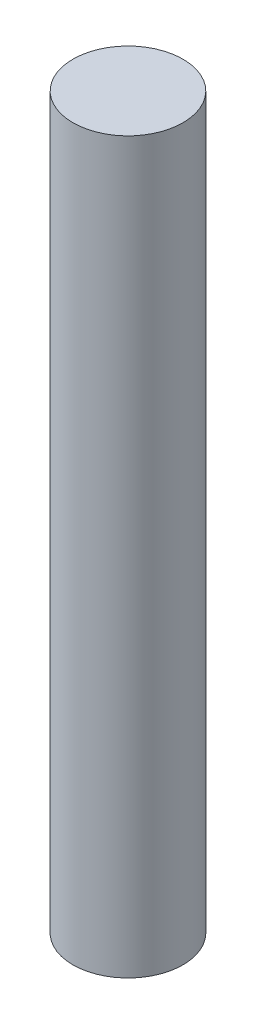
ISO-10303-21;
HEADER;
FILE_DESCRIPTION(('STEP AP214'),'2;1');
FILE_NAME('part.step','',(''),(''),'','','');
FILE_SCHEMA(('AUTOMOTIVE_DESIGN { 1 0 10303 214 1 1 1 1 }'));
ENDSEC;
DATA;
#1=APPLICATION_CONTEXT('core data for automotive mechanical design processes');
#2=APPLICATION_PROTOCOL_DEFINITION('international standard','automotive_design',2000,#1);
#3=PRODUCT_CONTEXT('',#1,'mechanical');
#4=PRODUCT('Part','Part','',(#3));
#5=PRODUCT_RELATED_PRODUCT_CATEGORY('part','',(#4));
#6=PRODUCT_DEFINITION_FORMATION('','',#4);
#7=PRODUCT_DEFINITION_CONTEXT('part definition',#1,'design');
#8=PRODUCT_DEFINITION('design','',#6,#7);
#9=PRODUCT_DEFINITION_SHAPE('','',#8);
#10=(LENGTH_UNIT() NAMED_UNIT(*) SI_UNIT(.MILLI.,.METRE.));
#11=(NAMED_UNIT(*) PLANE_ANGLE_UNIT() SI_UNIT($,.RADIAN.));
#12=(NAMED_UNIT(*) SI_UNIT($,.STERADIAN.) SOLID_ANGLE_UNIT());
#13=UNCERTAINTY_MEASURE_WITH_UNIT(LENGTH_MEASURE(1.E-05),#10,'distance_accuracy_value','');
#14=(GEOMETRIC_REPRESENTATION_CONTEXT(3) GLOBAL_UNCERTAINTY_ASSIGNED_CONTEXT((#13)) GLOBAL_UNIT_ASSIGNED_CONTEXT((#10,
#11,#12)) REPRESENTATION_CONTEXT('',''));
#15=CARTESIAN_POINT('',(0.,0.,0.));
#16=DIRECTION('',(0.,0.,1.));
#17=DIRECTION('',(1.,0.,0.));
#18=AXIS2_PLACEMENT_3D('',#15,#16,#17);
#19=CARTESIAN_POINT('',(7.80806312569521,26.5,-19.8154207055458));
#20=DIRECTION('',(0.,-1.,0.));
#21=DIRECTION('',(0.,0.,-1.));
#22=AXIS2_PLACEMENT_3D('',#19,#20,#21);
#23=CYLINDRICAL_SURFACE('',#22,2.);
#24=CARTESIAN_POINT('',(7.80806312569521,26.5,-19.8154207055458));
#25=DIRECTION('',(0.,1.,0.));
#26=DIRECTION('',(0.,0.,1.));
#27=AXIS2_PLACEMENT_3D('',#24,#25,#26);
#28=CIRCLE('',#27,2.);
#29=CARTESIAN_POINT('',(7.80806312569521,26.5,-17.8154207055458));
#30=VERTEX_POINT('',#29);
#31=EDGE_CURVE('E10',#30,#30,#28,.T.);
#32=ORIENTED_EDGE('',*,*,#31,.F.);
#33=EDGE_LOOP('',(#32));
#34=FACE_BOUND('',#33,.T.);
#35=CARTESIAN_POINT('',(7.80806312569521,0.,-19.8154207055458));
#36=DIRECTION('',(0.,1.,0.));
#37=DIRECTION('',(0.,0.,1.));
#38=AXIS2_PLACEMENT_3D('',#35,#36,#37);
#39=CIRCLE('',#38,2.);
#40=CARTESIAN_POINT('',(7.80806312569521,0.,-17.8154207055458));
#41=VERTEX_POINT('',#40);
#42=EDGE_CURVE('E44',#41,#41,#39,.T.);
#43=ORIENTED_EDGE('',*,*,#42,.T.);
#44=EDGE_LOOP('',(#43));
#45=FACE_BOUND('',#44,.T.);
#46=ADVANCED_FACE('F41',(#34,#45),#23,.T.);
#47=CARTESIAN_POINT('',(7.80806312569521,26.5,-19.8154207055458));
#48=DIRECTION('',(0.,1.,0.));
#49=DIRECTION('',(0.,0.,1.));
#50=AXIS2_PLACEMENT_3D('',#47,#48,#49);
#51=PLANE('',#50);
#52=ORIENTED_EDGE('',*,*,#31,.T.);
#53=EDGE_LOOP('',(#52));
#54=FACE_BOUND('',#53,.T.);
#55=ADVANCED_FACE('F58',(#54),#51,.T.);
#56=CARTESIAN_POINT('',(7.80806312569521,0.,-19.8154207055458));
#57=DIRECTION('',(0.,1.,0.));
#58=DIRECTION('',(0.,0.,1.));
#59=AXIS2_PLACEMENT_3D('',#56,#57,#58);
#60=PLANE('',#59);
#61=ORIENTED_EDGE('',*,*,#42,.F.);
#62=EDGE_LOOP('',(#61));
#63=FACE_BOUND('',#62,.T.);
#64=ADVANCED_FACE('F56',(#63),#60,.F.);
#65=CLOSED_SHELL('',(#46,#55,#64));
#66=MANIFOLD_SOLID_BREP('B2',#65);
#67=ADVANCED_BREP_SHAPE_REPRESENTATION('',(#18,#66),#14);
#68=SHAPE_DEFINITION_REPRESENTATION(#9,#67);
ENDSEC;
END-ISO-10303-21;
